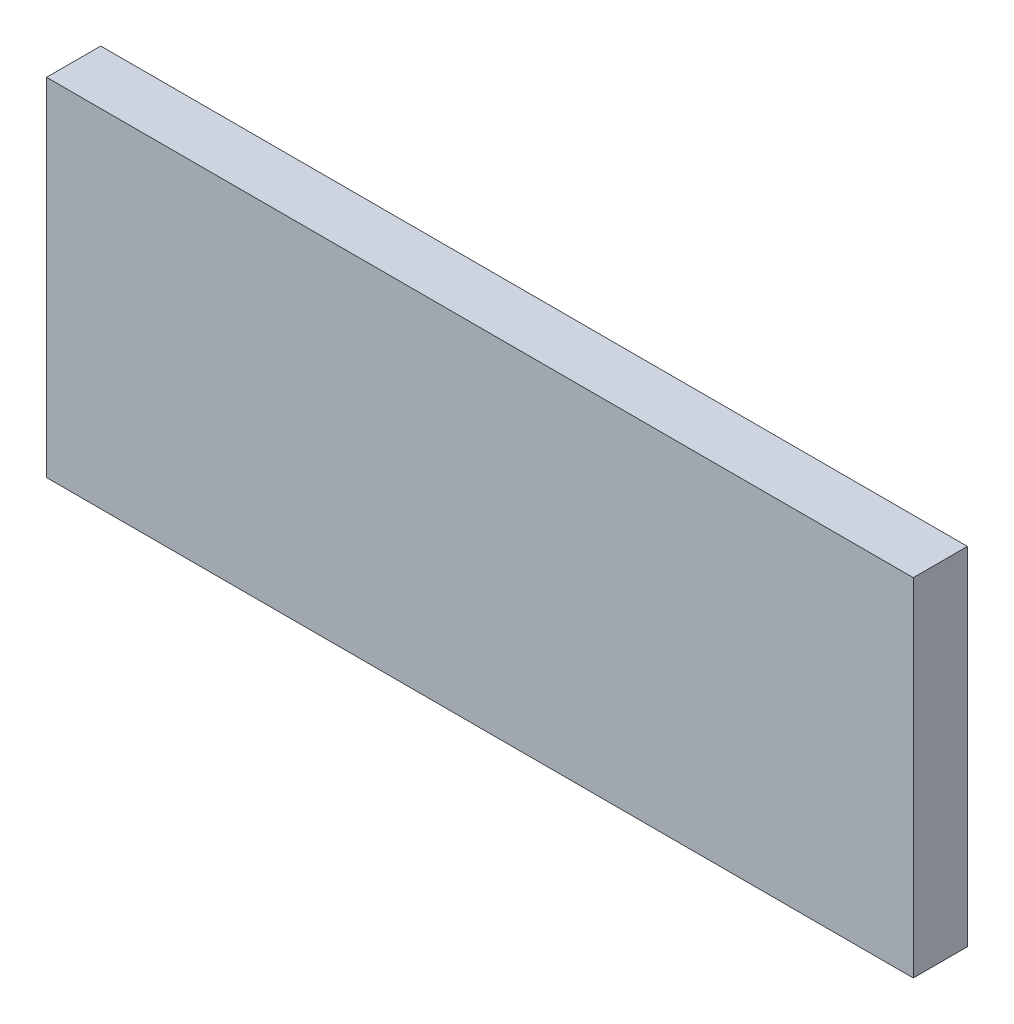
ISO-10303-21;
HEADER;
FILE_DESCRIPTION(('STEP AP214'),'2;1');
FILE_NAME('part.step','',(''),(''),'','','');
FILE_SCHEMA(('AUTOMOTIVE_DESIGN { 1 0 10303 214 1 1 1 1 }'));
ENDSEC;
DATA;
#1=APPLICATION_CONTEXT('core data for automotive mechanical design processes');
#2=APPLICATION_PROTOCOL_DEFINITION('international standard','automotive_design',2000,#1);
#3=PRODUCT_CONTEXT('',#1,'mechanical');
#4=PRODUCT('Part','Part','',(#3));
#5=PRODUCT_RELATED_PRODUCT_CATEGORY('part','',(#4));
#6=PRODUCT_DEFINITION_FORMATION('','',#4);
#7=PRODUCT_DEFINITION_CONTEXT('part definition',#1,'design');
#8=PRODUCT_DEFINITION('design','',#6,#7);
#9=PRODUCT_DEFINITION_SHAPE('','',#8);
#10=(LENGTH_UNIT() NAMED_UNIT(*) SI_UNIT(.MILLI.,.METRE.));
#11=(NAMED_UNIT(*) PLANE_ANGLE_UNIT() SI_UNIT($,.RADIAN.));
#12=(NAMED_UNIT(*) SI_UNIT($,.STERADIAN.) SOLID_ANGLE_UNIT());
#13=UNCERTAINTY_MEASURE_WITH_UNIT(LENGTH_MEASURE(1.E-05),#10,'distance_accuracy_value','');
#14=(GEOMETRIC_REPRESENTATION_CONTEXT(3) GLOBAL_UNCERTAINTY_ASSIGNED_CONTEXT((#13)) GLOBAL_UNIT_ASSIGNED_CONTEXT((#10,
#11,#12)) REPRESENTATION_CONTEXT('',''));
#15=CARTESIAN_POINT('',(0.,0.,0.));
#16=DIRECTION('',(0.,0.,1.));
#17=DIRECTION('',(1.,0.,0.));
#18=AXIS2_PLACEMENT_3D('',#15,#16,#17);
#19=CARTESIAN_POINT('',(40.,16.,5.));
#20=DIRECTION('',(0.,-1.,0.));
#21=DIRECTION('',(0.,0.,-1.));
#22=AXIS2_PLACEMENT_3D('',#19,#20,#21);
#23=PLANE('',#22);
#24=DIRECTION('',(-1.,0.,0.));
#25=VECTOR('',#24,1.);
#26=CARTESIAN_POINT('',(40.,16.,0.));
#27=LINE('',#26,#25);
#28=CARTESIAN_POINT('',(40.,16.,0.));
#29=VERTEX_POINT('',#28);
#30=CARTESIAN_POINT('',(-40.,16.,0.));
#31=VERTEX_POINT('',#30);
#32=EDGE_CURVE('E102',#29,#31,#27,.T.);
#33=ORIENTED_EDGE('',*,*,#32,.T.);
#34=DIRECTION('',(0.,0.,-1.));
#35=VECTOR('',#34,1.);
#36=CARTESIAN_POINT('',(-40.,16.,5.));
#37=LINE('',#36,#35);
#38=CARTESIAN_POINT('',(-40.,16.,5.));
#39=VERTEX_POINT('',#38);
#40=EDGE_CURVE('E11',#39,#31,#37,.T.);
#41=ORIENTED_EDGE('',*,*,#40,.F.);
#42=DIRECTION('',(-1.,0.,0.));
#43=VECTOR('',#42,1.);
#44=CARTESIAN_POINT('',(40.,16.,5.));
#45=LINE('',#44,#43);
#46=CARTESIAN_POINT('',(40.,16.,5.));
#47=VERTEX_POINT('',#46);
#48=EDGE_CURVE('E90',#47,#39,#45,.T.);
#49=ORIENTED_EDGE('',*,*,#48,.F.);
#50=DIRECTION('',(0.,0.,-1.));
#51=VECTOR('',#50,1.);
#52=CARTESIAN_POINT('',(40.,16.,5.));
#53=LINE('',#52,#51);
#54=EDGE_CURVE('E98',#47,#29,#53,.T.);
#55=ORIENTED_EDGE('',*,*,#54,.T.);
#56=EDGE_LOOP('',(#33,#41,#49,#55));
#57=FACE_BOUND('',#56,.T.);
#58=ADVANCED_FACE('F39',(#57),#23,.F.);
#59=CARTESIAN_POINT('',(-40.,-16.,5.));
#60=DIRECTION('',(1.,0.,0.));
#61=DIRECTION('',(0.,0.,-1.));
#62=AXIS2_PLACEMENT_3D('',#59,#60,#61);
#63=PLANE('',#62);
#64=DIRECTION('',(0.,-1.,0.));
#65=VECTOR('',#64,1.);
#66=CARTESIAN_POINT('',(-40.,-16.,0.));
#67=LINE('',#66,#65);
#68=CARTESIAN_POINT('',(-40.,-16.,0.));
#69=VERTEX_POINT('',#68);
#70=EDGE_CURVE('E94',#31,#69,#67,.T.);
#71=ORIENTED_EDGE('',*,*,#70,.T.);
#72=DIRECTION('',(0.,0.,-1.));
#73=VECTOR('',#72,1.);
#74=CARTESIAN_POINT('',(-40.,-16.,5.));
#75=LINE('',#74,#73);
#76=CARTESIAN_POINT('',(-40.,-16.,5.));
#77=VERTEX_POINT('',#76);
#78=EDGE_CURVE('E47',#77,#69,#75,.T.);
#79=ORIENTED_EDGE('',*,*,#78,.F.);
#80=DIRECTION('',(0.,-1.,0.));
#81=VECTOR('',#80,1.);
#82=CARTESIAN_POINT('',(-40.,-16.,5.));
#83=LINE('',#82,#81);
#84=EDGE_CURVE('E85',#39,#77,#83,.T.);
#85=ORIENTED_EDGE('',*,*,#84,.F.);
#86=ORIENTED_EDGE('',*,*,#40,.T.);
#87=EDGE_LOOP('',(#71,#79,#85,#86));
#88=FACE_BOUND('',#87,.T.);
#89=ADVANCED_FACE('F93',(#88),#63,.F.);
#90=CARTESIAN_POINT('',(40.,-16.,5.));
#91=DIRECTION('',(0.,1.,0.));
#92=DIRECTION('',(0.,0.,1.));
#93=AXIS2_PLACEMENT_3D('',#90,#91,#92);
#94=PLANE('',#93);
#95=DIRECTION('',(1.,0.,0.));
#96=VECTOR('',#95,1.);
#97=CARTESIAN_POINT('',(40.,-16.,0.));
#98=LINE('',#97,#96);
#99=CARTESIAN_POINT('',(40.,-16.,0.));
#100=VERTEX_POINT('',#99);
#101=EDGE_CURVE('E72',#69,#100,#98,.T.);
#102=ORIENTED_EDGE('',*,*,#101,.T.);
#103=DIRECTION('',(0.,0.,-1.));
#104=VECTOR('',#103,1.);
#105=CARTESIAN_POINT('',(40.,-16.,5.));
#106=LINE('',#105,#104);
#107=CARTESIAN_POINT('',(40.,-16.,5.));
#108=VERTEX_POINT('',#107);
#109=EDGE_CURVE('E95',#108,#100,#106,.T.);
#110=ORIENTED_EDGE('',*,*,#109,.F.);
#111=DIRECTION('',(1.,0.,0.));
#112=VECTOR('',#111,1.);
#113=CARTESIAN_POINT('',(40.,-16.,5.));
#114=LINE('',#113,#112);
#115=EDGE_CURVE('E88',#77,#108,#114,.T.);
#116=ORIENTED_EDGE('',*,*,#115,.F.);
#117=ORIENTED_EDGE('',*,*,#78,.T.);
#118=EDGE_LOOP('',(#102,#110,#116,#117));
#119=FACE_BOUND('',#118,.T.);
#120=ADVANCED_FACE('F96',(#119),#94,.F.);
#121=CARTESIAN_POINT('',(40.,-16.,5.));
#122=DIRECTION('',(-1.,0.,0.));
#123=DIRECTION('',(0.,0.,1.));
#124=AXIS2_PLACEMENT_3D('',#121,#122,#123);
#125=PLANE('',#124);
#126=DIRECTION('',(0.,1.,0.));
#127=VECTOR('',#126,1.);
#128=CARTESIAN_POINT('',(40.,-16.,0.));
#129=LINE('',#128,#127);
#130=EDGE_CURVE('E78',#100,#29,#129,.T.);
#131=ORIENTED_EDGE('',*,*,#130,.T.);
#132=ORIENTED_EDGE('',*,*,#54,.F.);
#133=DIRECTION('',(0.,1.,0.));
#134=VECTOR('',#133,1.);
#135=CARTESIAN_POINT('',(40.,-16.,5.));
#136=LINE('',#135,#134);
#137=EDGE_CURVE('E55',#108,#47,#136,.T.);
#138=ORIENTED_EDGE('',*,*,#137,.F.);
#139=ORIENTED_EDGE('',*,*,#109,.T.);
#140=EDGE_LOOP('',(#131,#132,#138,#139));
#141=FACE_BOUND('',#140,.T.);
#142=ADVANCED_FACE('F109',(#141),#125,.F.);
#143=CARTESIAN_POINT('',(0.,0.,5.));
#144=DIRECTION('',(0.,0.,-1.));
#145=DIRECTION('',(-1.,0.,0.));
#146=AXIS2_PLACEMENT_3D('',#143,#144,#145);
#147=PLANE('',#146);
#148=ORIENTED_EDGE('',*,*,#48,.T.);
#149=ORIENTED_EDGE('',*,*,#84,.T.);
#150=ORIENTED_EDGE('',*,*,#115,.T.);
#151=ORIENTED_EDGE('',*,*,#137,.T.);
#152=EDGE_LOOP('',(#148,#149,#150,#151));
#153=FACE_BOUND('',#152,.T.);
#154=ADVANCED_FACE('F86',(#153),#147,.F.);
#155=CARTESIAN_POINT('',(0.,0.,0.));
#156=DIRECTION('',(0.,0.,-1.));
#157=DIRECTION('',(-1.,0.,0.));
#158=AXIS2_PLACEMENT_3D('',#155,#156,#157);
#159=PLANE('',#158);
#160=ORIENTED_EDGE('',*,*,#32,.F.);
#161=ORIENTED_EDGE('',*,*,#130,.F.);
#162=ORIENTED_EDGE('',*,*,#101,.F.);
#163=ORIENTED_EDGE('',*,*,#70,.F.);
#164=EDGE_LOOP('',(#160,#161,#162,#163));
#165=FACE_BOUND('',#164,.T.);
#166=ADVANCED_FACE('F112',(#165),#159,.T.);
#167=CLOSED_SHELL('',(#58,#89,#120,#142,#154,#166));
#168=MANIFOLD_SOLID_BREP('B2',#167);
#169=ADVANCED_BREP_SHAPE_REPRESENTATION('',(#18,#168),#14);
#170=SHAPE_DEFINITION_REPRESENTATION(#9,#169);
ENDSEC;
END-ISO-10303-21;
